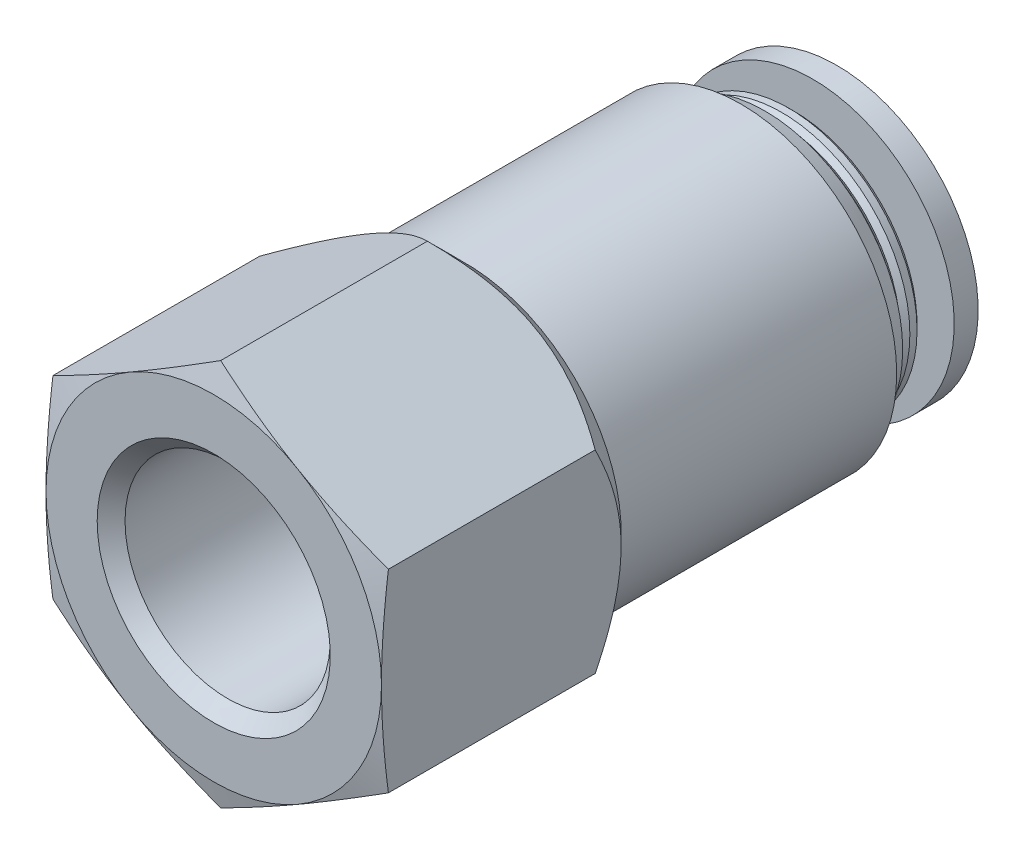
ISO-10303-21;
HEADER;
FILE_DESCRIPTION(('STEP AP214'),'2;1');
FILE_NAME('part.step','',(''),(''),'','','');
FILE_SCHEMA(('AUTOMOTIVE_DESIGN { 1 0 10303 214 1 1 1 1 }'));
ENDSEC;
DATA;
#1=APPLICATION_CONTEXT('core data for automotive mechanical design processes');
#2=APPLICATION_PROTOCOL_DEFINITION('international standard','automotive_design',2000,#1);
#3=PRODUCT_CONTEXT('',#1,'mechanical');
#4=PRODUCT('Part','Part','',(#3));
#5=PRODUCT_RELATED_PRODUCT_CATEGORY('part','',(#4));
#6=PRODUCT_DEFINITION_FORMATION('','',#4);
#7=PRODUCT_DEFINITION_CONTEXT('part definition',#1,'design');
#8=PRODUCT_DEFINITION('design','',#6,#7);
#9=PRODUCT_DEFINITION_SHAPE('','',#8);
#10=(LENGTH_UNIT() NAMED_UNIT(*) SI_UNIT(.MILLI.,.METRE.));
#11=(NAMED_UNIT(*) PLANE_ANGLE_UNIT() SI_UNIT($,.RADIAN.));
#12=(NAMED_UNIT(*) SI_UNIT($,.STERADIAN.) SOLID_ANGLE_UNIT());
#13=UNCERTAINTY_MEASURE_WITH_UNIT(LENGTH_MEASURE(1.E-05),#10,'distance_accuracy_value','');
#14=(GEOMETRIC_REPRESENTATION_CONTEXT(3) GLOBAL_UNCERTAINTY_ASSIGNED_CONTEXT((#13)) GLOBAL_UNIT_ASSIGNED_CONTEXT((#10,
#11,#12)) REPRESENTATION_CONTEXT('',''));
#15=CARTESIAN_POINT('',(0.,0.,0.));
#16=DIRECTION('',(0.,0.,1.));
#17=DIRECTION('',(1.,0.,0.));
#18=AXIS2_PLACEMENT_3D('',#15,#16,#17);
#19=CARTESIAN_POINT('',(0.,0.,19.5));
#20=DIRECTION('',(0.,0.,1.));
#21=DIRECTION('',(-1.,0.,0.));
#22=AXIS2_PLACEMENT_3D('',#19,#20,#21);
#23=CYLINDRICAL_SURFACE('',#22,4.283);
#24=CARTESIAN_POINT('',(0.,0.,19.5));
#25=DIRECTION('',(0.,0.,-1.));
#26=DIRECTION('',(-1.,0.,0.));
#27=AXIS2_PLACEMENT_3D('',#24,#25,#26);
#28=CIRCLE('',#27,4.283);
#29=CARTESIAN_POINT('',(-4.283,0.,19.5));
#30=VERTEX_POINT('',#29);
#31=EDGE_CURVE('E328',#30,#30,#28,.T.);
#32=ORIENTED_EDGE('',*,*,#31,.T.);
#33=EDGE_LOOP('',(#32));
#34=FACE_BOUND('',#33,.T.);
#35=CARTESIAN_POINT('',(0.,0.,25.919));
#36=DIRECTION('',(0.,0.,-1.));
#37=DIRECTION('',(-1.,0.,0.));
#38=AXIS2_PLACEMENT_3D('',#35,#36,#37);
#39=CIRCLE('',#38,4.283);
#40=CARTESIAN_POINT('',(-4.283,0.,25.919));
#41=VERTEX_POINT('',#40);
#42=EDGE_CURVE('E555',#41,#41,#39,.T.);
#43=ORIENTED_EDGE('',*,*,#42,.F.);
#44=EDGE_LOOP('',(#43));
#45=FACE_BOUND('',#44,.T.);
#46=ADVANCED_FACE('F15',(#34,#45),#23,.F.);
#47=CARTESIAN_POINT('',(0.,0.,4.5));
#48=DIRECTION('',(0.,0.,1.));
#49=DIRECTION('',(1.,0.,0.));
#50=AXIS2_PLACEMENT_3D('',#47,#48,#49);
#51=CONICAL_SURFACE('',#50,6.5,1.22173047639603);
#52=CARTESIAN_POINT('',(0.,0.,4.33804128297466));
#53=DIRECTION('',(0.,0.,-1.));
#54=DIRECTION('',(-1.,0.,0.));
#55=AXIS2_PLACEMENT_3D('',#52,#53,#54);
#56=CIRCLE('',#55,6.05502208208904);
#57=CARTESIAN_POINT('',(-6.05502208208904,0.,4.33804128297466));
#58=VERTEX_POINT('',#57);
#59=EDGE_CURVE('E9',#58,#58,#56,.T.);
#60=ORIENTED_EDGE('',*,*,#59,.F.);
#61=EDGE_LOOP('',(#60));
#62=FACE_BOUND('',#61,.T.);
#63=CARTESIAN_POINT('',(0.,0.,4.5));
#64=DIRECTION('',(0.,0.,-1.));
#65=DIRECTION('',(-1.,0.,0.));
#66=AXIS2_PLACEMENT_3D('',#63,#64,#65);
#67=CIRCLE('',#66,6.5);
#68=CARTESIAN_POINT('',(-6.5,0.,4.5));
#69=VERTEX_POINT('',#68);
#70=EDGE_CURVE('E144',#69,#69,#67,.T.);
#71=ORIENTED_EDGE('',*,*,#70,.T.);
#72=EDGE_LOOP('',(#71));
#73=FACE_BOUND('',#72,.T.);
#74=ADVANCED_FACE('F536',(#62,#73),#51,.T.);
#75=CARTESIAN_POINT('',(0.,0.,4.33804128297466));
#76=DIRECTION('',(0.,0.,1.));
#77=DIRECTION('',(1.,0.,0.));
#78=AXIS2_PLACEMENT_3D('',#75,#76,#77);
#79=CONICAL_SURFACE('',#78,6.05502208208904,0.349065850398866);
#80=CARTESIAN_POINT('',(0.,0.,3.5));
#81=DIRECTION('',(0.,0.,-1.));
#82=DIRECTION('',(-1.,0.,0.));
#83=AXIS2_PLACEMENT_3D('',#80,#81,#82);
#84=CIRCLE('',#83,5.75);
#85=CARTESIAN_POINT('',(-5.75,0.,3.5));
#86=VERTEX_POINT('',#85);
#87=EDGE_CURVE('E28',#86,#86,#84,.T.);
#88=ORIENTED_EDGE('',*,*,#87,.F.);
#89=EDGE_LOOP('',(#88));
#90=FACE_BOUND('',#89,.T.);
#91=ORIENTED_EDGE('',*,*,#59,.T.);
#92=EDGE_LOOP('',(#91));
#93=FACE_BOUND('',#92,.T.);
#94=ADVANCED_FACE('F17',(#90,#93),#79,.T.);
#95=CARTESIAN_POINT('',(0.,5.75,3.5));
#96=DIRECTION('',(0.,0.,1.));
#97=DIRECTION('',(1.,0.,0.));
#98=AXIS2_PLACEMENT_3D('',#95,#96,#97);
#99=PLANE('',#98);
#100=CARTESIAN_POINT('',(0.,0.,3.5));
#101=DIRECTION('',(0.,0.,-1.));
#102=DIRECTION('',(-1.,0.,0.));
#103=AXIS2_PLACEMENT_3D('',#100,#101,#102);
#104=CIRCLE('',#103,5.35);
#105=CARTESIAN_POINT('',(-5.35,0.,3.5));
#106=VERTEX_POINT('',#105);
#107=EDGE_CURVE('E685',#106,#106,#104,.T.);
#108=ORIENTED_EDGE('',*,*,#107,.F.);
#109=EDGE_LOOP('',(#108));
#110=FACE_BOUND('',#109,.T.);
#111=ORIENTED_EDGE('',*,*,#87,.T.);
#112=EDGE_LOOP('',(#111));
#113=FACE_BOUND('',#112,.T.);
#114=ADVANCED_FACE('F356',(#110,#113),#99,.F.);
#115=CARTESIAN_POINT('',(0.,0.,0.));
#116=DIRECTION('',(0.,0.,1.));
#117=DIRECTION('',(-1.,0.,0.));
#118=AXIS2_PLACEMENT_3D('',#115,#116,#117);
#119=CYLINDRICAL_SURFACE('',#118,5.35);
#120=CARTESIAN_POINT('',(0.,0.,3.2));
#121=DIRECTION('',(0.,0.,-1.));
#122=DIRECTION('',(-1.,0.,0.));
#123=AXIS2_PLACEMENT_3D('',#120,#121,#122);
#124=CIRCLE('',#123,5.35);
#125=CARTESIAN_POINT('',(-5.35,0.,3.2));
#126=VERTEX_POINT('',#125);
#127=EDGE_CURVE('E678',#126,#126,#124,.T.);
#128=ORIENTED_EDGE('',*,*,#127,.F.);
#129=EDGE_LOOP('',(#128));
#130=FACE_BOUND('',#129,.T.);
#131=ORIENTED_EDGE('',*,*,#107,.T.);
#132=EDGE_LOOP('',(#131));
#133=FACE_BOUND('',#132,.T.);
#134=ADVANCED_FACE('F995',(#130,#133),#119,.T.);
#135=CARTESIAN_POINT('',(0.,0.,3.2));
#136=DIRECTION('',(0.,0.,1.));
#137=DIRECTION('',(1.,0.,0.));
#138=AXIS2_PLACEMENT_3D('',#135,#136,#137);
#139=CONICAL_SURFACE('',#138,5.35,0.785398163397449);
#140=CARTESIAN_POINT('',(0.,0.,3.));
#141=DIRECTION('',(0.,0.,-1.));
#142=DIRECTION('',(-1.,0.,0.));
#143=AXIS2_PLACEMENT_3D('',#140,#141,#142);
#144=CIRCLE('',#143,5.15);
#145=CARTESIAN_POINT('',(-5.15,0.,3.));
#146=VERTEX_POINT('',#145);
#147=EDGE_CURVE('E175',#146,#146,#144,.T.);
#148=ORIENTED_EDGE('',*,*,#147,.F.);
#149=EDGE_LOOP('',(#148));
#150=FACE_BOUND('',#149,.T.);
#151=ORIENTED_EDGE('',*,*,#127,.T.);
#152=EDGE_LOOP('',(#151));
#153=FACE_BOUND('',#152,.T.);
#154=ADVANCED_FACE('F765',(#150,#153),#139,.T.);
#155=CARTESIAN_POINT('',(0.,0.,3.));
#156=DIRECTION('',(0.,0.,-1.));
#157=DIRECTION('',(-1.,0.,0.));
#158=AXIS2_PLACEMENT_3D('',#155,#156,#157);
#159=CONICAL_SURFACE('',#158,5.15,0.785398163397449);
#160=ORIENTED_EDGE('',*,*,#147,.T.);
#161=EDGE_LOOP('',(#160));
#162=FACE_BOUND('',#161,.T.);
#163=CARTESIAN_POINT('',(0.,0.,2.8));
#164=DIRECTION('',(0.,0.,-1.));
#165=DIRECTION('',(-1.,0.,0.));
#166=AXIS2_PLACEMENT_3D('',#163,#164,#165);
#167=CIRCLE('',#166,5.35);
#168=CARTESIAN_POINT('',(-5.35,0.,2.8));
#169=VERTEX_POINT('',#168);
#170=EDGE_CURVE('E169',#169,#169,#167,.T.);
#171=ORIENTED_EDGE('',*,*,#170,.F.);
#172=EDGE_LOOP('',(#171));
#173=FACE_BOUND('',#172,.T.);
#174=ADVANCED_FACE('F452',(#162,#173),#159,.T.);
#175=CARTESIAN_POINT('',(0.,0.,0.));
#176=DIRECTION('',(0.,0.,1.));
#177=DIRECTION('',(-1.,0.,0.));
#178=AXIS2_PLACEMENT_3D('',#175,#176,#177);
#179=CYLINDRICAL_SURFACE('',#178,5.35);
#180=CARTESIAN_POINT('',(0.,0.,2.5));
#181=DIRECTION('',(0.,0.,-1.));
#182=DIRECTION('',(-1.,0.,0.));
#183=AXIS2_PLACEMENT_3D('',#180,#181,#182);
#184=CIRCLE('',#183,5.35);
#185=CARTESIAN_POINT('',(-5.35,0.,2.5));
#186=VERTEX_POINT('',#185);
#187=EDGE_CURVE('E165',#186,#186,#184,.T.);
#188=ORIENTED_EDGE('',*,*,#187,.F.);
#189=EDGE_LOOP('',(#188));
#190=FACE_BOUND('',#189,.T.);
#191=ORIENTED_EDGE('',*,*,#170,.T.);
#192=EDGE_LOOP('',(#191));
#193=FACE_BOUND('',#192,.T.);
#194=ADVANCED_FACE('F253',(#190,#193),#179,.T.);
#195=CARTESIAN_POINT('',(0.,0.,2.5));
#196=DIRECTION('',(0.,0.,1.));
#197=DIRECTION('',(1.,0.,0.));
#198=AXIS2_PLACEMENT_3D('',#195,#196,#197);
#199=CONICAL_SURFACE('',#198,5.35,0.785398163397449);
#200=CARTESIAN_POINT('',(0.,0.,2.3));
#201=DIRECTION('',(0.,0.,-1.));
#202=DIRECTION('',(-1.,0.,0.));
#203=AXIS2_PLACEMENT_3D('',#200,#201,#202);
#204=CIRCLE('',#203,5.15);
#205=CARTESIAN_POINT('',(-5.15,0.,2.3));
#206=VERTEX_POINT('',#205);
#207=EDGE_CURVE('E160',#206,#206,#204,.T.);
#208=ORIENTED_EDGE('',*,*,#207,.F.);
#209=EDGE_LOOP('',(#208));
#210=FACE_BOUND('',#209,.T.);
#211=ORIENTED_EDGE('',*,*,#187,.T.);
#212=EDGE_LOOP('',(#211));
#213=FACE_BOUND('',#212,.T.);
#214=ADVANCED_FACE('F166',(#210,#213),#199,.T.);
#215=CARTESIAN_POINT('',(0.,5.15,2.3));
#216=DIRECTION('',(0.,0.,1.));
#217=DIRECTION('',(1.,0.,0.));
#218=AXIS2_PLACEMENT_3D('',#215,#216,#217);
#219=PLANE('',#218);
#220=CARTESIAN_POINT('',(0.,0.,2.3));
#221=DIRECTION('',(0.,0.,-1.));
#222=DIRECTION('',(-1.,0.,0.));
#223=AXIS2_PLACEMENT_3D('',#220,#221,#222);
#224=CIRCLE('',#223,4.);
#225=CARTESIAN_POINT('',(-4.,0.,2.3));
#226=VERTEX_POINT('',#225);
#227=EDGE_CURVE('E178',#226,#226,#224,.T.);
#228=ORIENTED_EDGE('',*,*,#227,.F.);
#229=EDGE_LOOP('',(#228));
#230=FACE_BOUND('',#229,.T.);
#231=ORIENTED_EDGE('',*,*,#207,.T.);
#232=EDGE_LOOP('',(#231));
#233=FACE_BOUND('',#232,.T.);
#234=ADVANCED_FACE('F493',(#230,#233),#219,.F.);
#235=CARTESIAN_POINT('',(0.,0.,0.));
#236=DIRECTION('',(0.,0.,1.));
#237=DIRECTION('',(-1.,0.,0.));
#238=AXIS2_PLACEMENT_3D('',#235,#236,#237);
#239=CYLINDRICAL_SURFACE('',#238,4.);
#240=CARTESIAN_POINT('',(0.,0.,1.5));
#241=DIRECTION('',(0.,0.,-1.));
#242=DIRECTION('',(-1.,0.,0.));
#243=AXIS2_PLACEMENT_3D('',#240,#241,#242);
#244=CIRCLE('',#243,4.);
#245=CARTESIAN_POINT('',(-4.,0.,1.5));
#246=VERTEX_POINT('',#245);
#247=EDGE_CURVE('E665',#246,#246,#244,.T.);
#248=ORIENTED_EDGE('',*,*,#247,.F.);
#249=EDGE_LOOP('',(#248));
#250=FACE_BOUND('',#249,.T.);
#251=ORIENTED_EDGE('',*,*,#227,.T.);
#252=EDGE_LOOP('',(#251));
#253=FACE_BOUND('',#252,.T.);
#254=ADVANCED_FACE('F495',(#250,#253),#239,.T.);
#255=CARTESIAN_POINT('',(0.,4.,1.5));
#256=DIRECTION('',(0.,0.,-1.));
#257=DIRECTION('',(0.,-1.,0.));
#258=AXIS2_PLACEMENT_3D('',#255,#256,#257);
#259=PLANE('',#258);
#260=ORIENTED_EDGE('',*,*,#247,.T.);
#261=EDGE_LOOP('',(#260));
#262=FACE_BOUND('',#261,.T.);
#263=CARTESIAN_POINT('',(0.,0.,1.5));
#264=DIRECTION('',(0.,0.,-1.));
#265=DIRECTION('',(-1.,0.,0.));
#266=AXIS2_PLACEMENT_3D('',#263,#264,#265);
#267=CIRCLE('',#266,5.9);
#268=CARTESIAN_POINT('',(-5.9,0.,1.5));
#269=VERTEX_POINT('',#268);
#270=EDGE_CURVE('E661',#269,#269,#267,.T.);
#271=ORIENTED_EDGE('',*,*,#270,.F.);
#272=EDGE_LOOP('',(#271));
#273=FACE_BOUND('',#272,.T.);
#274=ADVANCED_FACE('F497',(#262,#273),#259,.F.);
#275=CARTESIAN_POINT('',(0.,0.,0.));
#276=DIRECTION('',(0.,0.,1.));
#277=DIRECTION('',(-1.,0.,0.));
#278=AXIS2_PLACEMENT_3D('',#275,#276,#277);
#279=CYLINDRICAL_SURFACE('',#278,5.9);
#280=CARTESIAN_POINT('',(0.,0.,0.5));
#281=DIRECTION('',(0.,0.,-1.));
#282=DIRECTION('',(-1.,0.,0.));
#283=AXIS2_PLACEMENT_3D('',#280,#281,#282);
#284=CIRCLE('',#283,5.9);
#285=CARTESIAN_POINT('',(-5.9,0.,0.5));
#286=VERTEX_POINT('',#285);
#287=EDGE_CURVE('E659',#286,#286,#284,.T.);
#288=ORIENTED_EDGE('',*,*,#287,.F.);
#289=EDGE_LOOP('',(#288));
#290=FACE_BOUND('',#289,.T.);
#291=ORIENTED_EDGE('',*,*,#270,.T.);
#292=EDGE_LOOP('',(#291));
#293=FACE_BOUND('',#292,.T.);
#294=ADVANCED_FACE('F489',(#290,#293),#279,.T.);
#295=CARTESIAN_POINT('',(0.,0.,0.5));
#296=DIRECTION('',(0.,0.,1.));
#297=DIRECTION('',(1.,0.,0.));
#298=AXIS2_PLACEMENT_3D('',#295,#296,#297);
#299=CONICAL_SURFACE('',#298,5.9,1.31347261182381);
#300=CARTESIAN_POINT('',(0.,0.,0.));
#301=DIRECTION('',(0.,0.,-1.));
#302=DIRECTION('',(-1.,0.,0.));
#303=AXIS2_PLACEMENT_3D('',#300,#301,#302);
#304=CIRCLE('',#303,4.);
#305=CARTESIAN_POINT('',(-4.,0.,0.));
#306=VERTEX_POINT('',#305);
#307=EDGE_CURVE('E670',#306,#306,#304,.T.);
#308=ORIENTED_EDGE('',*,*,#307,.F.);
#309=EDGE_LOOP('',(#308));
#310=FACE_BOUND('',#309,.T.);
#311=ORIENTED_EDGE('',*,*,#287,.T.);
#312=EDGE_LOOP('',(#311));
#313=FACE_BOUND('',#312,.T.);
#314=ADVANCED_FACE('F484',(#310,#313),#299,.T.);
#315=CARTESIAN_POINT('',(0.,4.,0.));
#316=DIRECTION('',(0.,0.,1.));
#317=DIRECTION('',(1.,0.,0.));
#318=AXIS2_PLACEMENT_3D('',#315,#316,#317);
#319=PLANE('',#318);
#320=CARTESIAN_POINT('',(0.,0.,0.));
#321=DIRECTION('',(0.,0.,-1.));
#322=DIRECTION('',(-1.,0.,0.));
#323=AXIS2_PLACEMENT_3D('',#320,#321,#322);
#324=CIRCLE('',#323,3.);
#325=CARTESIAN_POINT('',(-3.,0.,0.));
#326=VERTEX_POINT('',#325);
#327=EDGE_CURVE('E674',#326,#326,#324,.T.);
#328=ORIENTED_EDGE('',*,*,#327,.F.);
#329=EDGE_LOOP('',(#328));
#330=FACE_BOUND('',#329,.T.);
#331=ORIENTED_EDGE('',*,*,#307,.T.);
#332=EDGE_LOOP('',(#331));
#333=FACE_BOUND('',#332,.T.);
#334=ADVANCED_FACE('F488',(#330,#333),#319,.F.);
#335=CARTESIAN_POINT('',(0.,0.,0.));
#336=DIRECTION('',(0.,0.,1.));
#337=DIRECTION('',(-1.,0.,0.));
#338=AXIS2_PLACEMENT_3D('',#335,#336,#337);
#339=CYLINDRICAL_SURFACE('',#338,3.);
#340=CARTESIAN_POINT('',(0.,0.,17.));
#341=DIRECTION('',(0.,0.,-1.));
#342=DIRECTION('',(-1.,0.,0.));
#343=AXIS2_PLACEMENT_3D('',#340,#341,#342);
#344=CIRCLE('',#343,3.);
#345=CARTESIAN_POINT('',(-3.,0.,17.));
#346=VERTEX_POINT('',#345);
#347=EDGE_CURVE('E270',#346,#346,#344,.T.);
#348=ORIENTED_EDGE('',*,*,#347,.F.);
#349=EDGE_LOOP('',(#348));
#350=FACE_BOUND('',#349,.T.);
#351=ORIENTED_EDGE('',*,*,#327,.T.);
#352=EDGE_LOOP('',(#351));
#353=FACE_BOUND('',#352,.T.);
#354=ADVANCED_FACE('F501',(#350,#353),#339,.F.);
#355=CARTESIAN_POINT('',(0.,0.,17.));
#356=DIRECTION('',(0.,0.,1.));
#357=DIRECTION('',(1.,0.,0.));
#358=AXIS2_PLACEMENT_3D('',#355,#356,#357);
#359=CONICAL_SURFACE('',#358,3.,0.349065850398866);
#360=ORIENTED_EDGE('',*,*,#347,.T.);
#361=EDGE_LOOP('',(#360));
#362=FACE_BOUND('',#361,.T.);
#363=CARTESIAN_POINT('',(0.,0.,19.5));
#364=DIRECTION('',(0.,0.,-1.));
#365=DIRECTION('',(-1.,0.,0.));
#366=AXIS2_PLACEMENT_3D('',#363,#364,#365);
#367=CIRCLE('',#366,3.90992558566551);
#368=CARTESIAN_POINT('',(-3.90992558566551,0.,19.5));
#369=VERTEX_POINT('',#368);
#370=EDGE_CURVE('E182',#369,#369,#367,.T.);
#371=ORIENTED_EDGE('',*,*,#370,.F.);
#372=EDGE_LOOP('',(#371));
#373=FACE_BOUND('',#372,.T.);
#374=ADVANCED_FACE('F454',(#362,#373),#359,.F.);
#375=CARTESIAN_POINT('',(-7.,4.04145188432738,16.));
#376=DIRECTION('',(-1.,0.,0.));
#377=DIRECTION('',(0.,0.,1.));
#378=AXIS2_PLACEMENT_3D('',#375,#376,#377);
#379=PLANE('',#378);
#380=CARTESIAN_POINT('',(-7.,-4.04145188432738,26.2098368097083));
#381=CARTESIAN_POINT('',(-7.,-2.97869081401696,26.3522197949768));
#382=CARTESIAN_POINT('',(-7.,-2.02017976804719,26.4234523991461));
#383=CARTESIAN_POINT('',(-7.,-0.990149744345751,26.5));
#384=CARTESIAN_POINT('',(-7.,0.,26.5));
#385=B_SPLINE_CURVE_WITH_KNOTS('',2,(#380,#381,#382,#383,#384),.UNSPECIFIED.,.F.,.F.,(3,2,3),
(0.,0.5,1.),.UNSPECIFIED.);
#386=CARTESIAN_POINT('',(-7.,-4.04145188432738,26.2098368097083));
#387=VERTEX_POINT('',#386);
#388=CARTESIAN_POINT('',(-7.,0.,26.5));
#389=VERTEX_POINT('',#388);
#390=EDGE_CURVE('E516',#387,#389,#385,.T.);
#391=ORIENTED_EDGE('',*,*,#390,.T.);
#392=CARTESIAN_POINT('',(-7.,0.,26.5));
#393=CARTESIAN_POINT('',(-7.,1.8756443470176,26.5));
#394=CARTESIAN_POINT('',(-7.,4.04145188432738,26.2098368097083));
#395=B_SPLINE_CURVE_WITH_KNOTS('',2,(#392,#393,#394),.UNSPECIFIED.,.F.,.F.,(3,3),(0.,1.),.UNSPECIFIED.);
#396=CARTESIAN_POINT('',(-7.,4.04145188432738,26.2098368097083));
#397=VERTEX_POINT('',#396);
#398=EDGE_CURVE('E299',#389,#397,#395,.T.);
#399=ORIENTED_EDGE('',*,*,#398,.T.);
#400=DIRECTION('',(0.,0.,1.));
#401=VECTOR('',#400,1.);
#402=CARTESIAN_POINT('',(-7.,4.04145188432738,16.));
#403=LINE('',#402,#401);
#404=CARTESIAN_POINT('',(-7.,4.04145188432738,17.5829037686548));
#405=VERTEX_POINT('',#404);
#406=EDGE_CURVE('E324',#405,#397,#403,.T.);
#407=ORIENTED_EDGE('',*,*,#406,.F.);
#408=CARTESIAN_POINT('',(-7.,4.04145188432738,17.5829037686548));
#409=CARTESIAN_POINT('',(-7.,3.01197757082129,17.0681666119017));
#410=CARTESIAN_POINT('',(-7.,2.081303600006,16.8028641419239));
#411=CARTESIAN_POINT('',(-7.,1.02005282265252,16.5003388093942));
#412=CARTESIAN_POINT('',(-7.,0.00177313035275902,16.5000002245708));
#413=CARTESIAN_POINT('',(-7.,-1.01656910779978,16.4996616189504));
#414=CARTESIAN_POINT('',(-7.,-2.07999426577288,16.8024910917884));
#415=CARTESIAN_POINT('',(-7.,-3.01069298940647,17.067524321194));
#416=CARTESIAN_POINT('',(-7.,-4.04145188432738,17.5829037686548));
#417=B_SPLINE_CURVE_WITH_KNOTS('',2,(#408,#409,#410,#411,#412,#413,#414,#415,#416),
.UNSPECIFIED.,.F.,.F.,(3,2,2,2,3),(0.,0.25,0.5,0.75,1.),.UNSPECIFIED.);
#418=CARTESIAN_POINT('',(-7.,-4.04145188432738,17.5829037686548));
#419=VERTEX_POINT('',#418);
#420=EDGE_CURVE('E550',#405,#419,#417,.T.);
#421=ORIENTED_EDGE('',*,*,#420,.T.);
#422=DIRECTION('',(0.,0.,1.));
#423=VECTOR('',#422,1.);
#424=CARTESIAN_POINT('',(-7.,-4.04145188432738,16.));
#425=LINE('',#424,#423);
#426=EDGE_CURVE('E380',#419,#387,#425,.T.);
#427=ORIENTED_EDGE('',*,*,#426,.T.);
#428=EDGE_LOOP('',(#391,#399,#407,#421,#427));
#429=FACE_BOUND('',#428,.T.);
#430=ADVANCED_FACE('F211',(#429),#379,.T.);
#431=CARTESIAN_POINT('',(7.,4.04145188432738,16.));
#432=DIRECTION('',(0.5,0.866025403784439,0.));
#433=DIRECTION('',(0.,0.,-1.));
#434=AXIS2_PLACEMENT_3D('',#431,#432,#433);
#435=PLANE('',#434);
#436=CARTESIAN_POINT('',(0.,8.08290376865476,26.2098368097085));
#437=CARTESIAN_POINT('',(1.87564434701639,7.00000000000084,26.5));
#438=CARTESIAN_POINT('',(3.5,6.06217782649107,26.5));
#439=B_SPLINE_CURVE_WITH_KNOTS('',2,(#436,#437,#438),.UNSPECIFIED.,.F.,.F.,(3,3),(0.,1.),.UNSPECIFIED.);
#440=CARTESIAN_POINT('',(0.,8.08290376865476,26.2098368097083));
#441=VERTEX_POINT('',#440);
#442=CARTESIAN_POINT('',(3.5,6.06217782649107,26.5));
#443=VERTEX_POINT('',#442);
#444=EDGE_CURVE('E195',#441,#443,#439,.T.);
#445=ORIENTED_EDGE('',*,*,#444,.T.);
#446=CARTESIAN_POINT('',(3.5,6.06217782649107,26.5));
#447=CARTESIAN_POINT('',(5.1243556529836,5.1243556529813,26.5));
#448=CARTESIAN_POINT('',(7.,4.04145188432738,26.2098368097085));
#449=B_SPLINE_CURVE_WITH_KNOTS('',2,(#446,#447,#448),.UNSPECIFIED.,.F.,.F.,(3,3),(0.,1.),.UNSPECIFIED.);
#450=CARTESIAN_POINT('',(7.,4.04145188432738,26.2098368097083));
#451=VERTEX_POINT('',#450);
#452=EDGE_CURVE('E232',#443,#451,#449,.T.);
#453=ORIENTED_EDGE('',*,*,#452,.T.);
#454=DIRECTION('',(0.,0.,1.));
#455=VECTOR('',#454,1.);
#456=CARTESIAN_POINT('',(7.,4.04145188432738,16.));
#457=LINE('',#456,#455);
#458=CARTESIAN_POINT('',(7.,4.04145188432738,17.5829037686548));
#459=VERTEX_POINT('',#458);
#460=EDGE_CURVE('E262',#459,#451,#457,.T.);
#461=ORIENTED_EDGE('',*,*,#460,.F.);
#462=CARTESIAN_POINT('',(7.,4.04145188432738,17.5829037686548));
#463=CARTESIAN_POINT('',(6.11501259574176,4.5523996004053,17.0719560525768));
#464=CARTESIAN_POINT('',(5.31453977573887,5.01455279851295,16.8068510862741));
#465=CARTESIAN_POINT('',(4.39484560613538,5.54553847490565,16.5022617413908));
#466=CARTESIAN_POINT('',(3.5128850710943,6.05473862722624,16.5000158118923));
#467=CARTESIAN_POINT('',(2.63021474124441,6.56434857977077,16.4977680748876));
#468=CARTESIAN_POINT('',(1.70887997841246,7.09628145310556,16.7991425004797));
#469=CARTESIAN_POINT('',(0.898226815189581,7.56431227511171,17.0643122751116));
#470=CARTESIAN_POINT('',(0.,8.08290376865478,17.5829037686547));
#471=B_SPLINE_CURVE_WITH_KNOTS('',2,(#462,#463,#464,#465,#466,#467,#468,#469,#470),
.UNSPECIFIED.,.F.,.F.,(3,2,2,2,3),(0.,0.25,0.5,0.75,1.),.UNSPECIFIED.);
#472=CARTESIAN_POINT('',(0.,8.08290376865476,17.5829037686548));
#473=VERTEX_POINT('',#472);
#474=EDGE_CURVE('E554',#459,#473,#471,.T.);
#475=ORIENTED_EDGE('',*,*,#474,.T.);
#476=DIRECTION('',(0.,0.,1.));
#477=VECTOR('',#476,1.);
#478=CARTESIAN_POINT('',(0.,8.08290376865476,16.));
#479=LINE('',#478,#477);
#480=EDGE_CURVE('E556',#473,#441,#479,.T.);
#481=ORIENTED_EDGE('',*,*,#480,.T.);
#482=EDGE_LOOP('',(#445,#453,#461,#475,#481));
#483=FACE_BOUND('',#482,.T.);
#484=ADVANCED_FACE('F201',(#483),#435,.T.);
#485=CARTESIAN_POINT('',(7.,-4.04145188432738,16.));
#486=DIRECTION('',(1.,0.,0.));
#487=DIRECTION('',(0.,1.,0.));
#488=AXIS2_PLACEMENT_3D('',#485,#486,#487);
#489=PLANE('',#488);
#490=CARTESIAN_POINT('',(7.,4.04145188432738,26.2098368097083));
#491=CARTESIAN_POINT('',(7.,1.87564434701761,26.5));
#492=CARTESIAN_POINT('',(7.,0.,26.5));
#493=B_SPLINE_CURVE_WITH_KNOTS('',2,(#490,#491,#492),.UNSPECIFIED.,.F.,.F.,(3,3),(0.,1.),.UNSPECIFIED.);
#494=CARTESIAN_POINT('',(7.,0.,26.5));
#495=VERTEX_POINT('',#494);
#496=EDGE_CURVE('E576',#451,#495,#493,.T.);
#497=ORIENTED_EDGE('',*,*,#496,.T.);
#498=CARTESIAN_POINT('',(7.,0.,26.5));
#499=CARTESIAN_POINT('',(7.,-0.989628842965374,26.5));
#500=CARTESIAN_POINT('',(7.,-2.02017976804718,26.4234523991461));
#501=CARTESIAN_POINT('',(7.,-2.97808767461878,26.3523006003341));
#502=CARTESIAN_POINT('',(7.,-4.04145188432738,26.2098368097083));
#503=B_SPLINE_CURVE_WITH_KNOTS('',2,(#498,#499,#500,#501,#502),.UNSPECIFIED.,.F.,.F.,(3,2,3),
(0.,0.5,1.),.UNSPECIFIED.);
#504=CARTESIAN_POINT('',(7.,-4.04145188432738,26.2098368097083));
#505=VERTEX_POINT('',#504);
#506=EDGE_CURVE('E277',#495,#505,#503,.T.);
#507=ORIENTED_EDGE('',*,*,#506,.T.);
#508=DIRECTION('',(0.,0.,1.));
#509=VECTOR('',#508,1.);
#510=CARTESIAN_POINT('',(7.,-4.04145188432738,16.));
#511=LINE('',#510,#509);
#512=CARTESIAN_POINT('',(7.,-4.04145188432738,17.5829037686548));
#513=VERTEX_POINT('',#512);
#514=EDGE_CURVE('E508',#513,#505,#511,.T.);
#515=ORIENTED_EDGE('',*,*,#514,.F.);
#516=CARTESIAN_POINT('',(7.,-4.04145188432738,17.5829037686548));
#517=CARTESIAN_POINT('',(7.,-3.01126093936133,17.0678082961715));
#518=CARTESIAN_POINT('',(7.,-2.07999426577287,16.8024910917884));
#519=CARTESIAN_POINT('',(7.,-1.01762569652326,16.4998230517825));
#520=CARTESIAN_POINT('',(7.,0.00177313035276076,16.5000002245708));
#521=CARTESIAN_POINT('',(7.,1.0189895798619,16.5001770180592));
#522=CARTESIAN_POINT('',(7.,2.081303600006,16.8028641419239));
#523=CARTESIAN_POINT('',(7.,3.01140197656456,17.0678788147733));
#524=CARTESIAN_POINT('',(7.,4.04145188432738,17.5829037686548));
#525=B_SPLINE_CURVE_WITH_KNOTS('',2,(#516,#517,#518,#519,#520,#521,#522,#523,#524),
.UNSPECIFIED.,.F.,.F.,(3,2,2,2,3),(0.,0.25,0.5,0.75,1.),.UNSPECIFIED.);
#526=EDGE_CURVE('E667',#513,#459,#525,.T.);
#527=ORIENTED_EDGE('',*,*,#526,.T.);
#528=ORIENTED_EDGE('',*,*,#460,.T.);
#529=EDGE_LOOP('',(#497,#507,#515,#527,#528));
#530=FACE_BOUND('',#529,.T.);
#531=ADVANCED_FACE('F210',(#530),#489,.T.);
#532=CARTESIAN_POINT('',(0.,0.,26.5));
#533=DIRECTION('',(0.,0.,-1.));
#534=DIRECTION('',(0.,-1.,0.));
#535=AXIS2_PLACEMENT_3D('',#532,#533,#534);
#536=PLANE('',#535);
#537=CARTESIAN_POINT('',(0.,0.,26.5));
#538=DIRECTION('',(0.,0.,-1.));
#539=DIRECTION('',(-1.,0.,0.));
#540=AXIS2_PLACEMENT_3D('',#537,#538,#539);
#541=CIRCLE('',#540,4.864);
#542=CARTESIAN_POINT('',(-4.864,0.,26.5));
#543=VERTEX_POINT('',#542);
#544=EDGE_CURVE('E701',#543,#543,#541,.T.);
#545=ORIENTED_EDGE('',*,*,#544,.T.);
#546=EDGE_LOOP('',(#545));
#547=FACE_BOUND('',#546,.T.);
#548=CARTESIAN_POINT('',(0.,0.,26.5));
#549=DIRECTION('',(0.,0.,-1.));
#550=DIRECTION('',(-1.,0.,0.));
#551=AXIS2_PLACEMENT_3D('',#548,#549,#550);
#552=CIRCLE('',#551,7.);
#553=CARTESIAN_POINT('',(-3.5,6.06217782649107,26.5));
#554=VERTEX_POINT('',#553);
#555=EDGE_CURVE('E271',#554,#443,#552,.T.);
#556=ORIENTED_EDGE('',*,*,#555,.F.);
#557=CARTESIAN_POINT('',(0.,0.,26.5));
#558=DIRECTION('',(0.,0.,-1.));
#559=DIRECTION('',(-1.,0.,0.));
#560=AXIS2_PLACEMENT_3D('',#557,#558,#559);
#561=CIRCLE('',#560,7.);
#562=EDGE_CURVE('E290',#389,#554,#561,.T.);
#563=ORIENTED_EDGE('',*,*,#562,.F.);
#564=CARTESIAN_POINT('',(0.,0.,26.5));
#565=DIRECTION('',(0.,0.,-1.));
#566=DIRECTION('',(-1.,0.,0.));
#567=AXIS2_PLACEMENT_3D('',#564,#565,#566);
#568=CIRCLE('',#567,7.);
#569=CARTESIAN_POINT('',(-3.5,-6.06217782649107,26.5));
#570=VERTEX_POINT('',#569);
#571=EDGE_CURVE('E316',#570,#389,#568,.T.);
#572=ORIENTED_EDGE('',*,*,#571,.F.);
#573=CARTESIAN_POINT('',(0.,0.,26.5));
#574=DIRECTION('',(0.,0.,-1.));
#575=DIRECTION('',(-1.,0.,0.));
#576=AXIS2_PLACEMENT_3D('',#573,#574,#575);
#577=CIRCLE('',#576,7.);
#578=CARTESIAN_POINT('',(3.5,-6.06217782649107,26.5));
#579=VERTEX_POINT('',#578);
#580=EDGE_CURVE('E184',#579,#570,#577,.T.);
#581=ORIENTED_EDGE('',*,*,#580,.F.);
#582=CARTESIAN_POINT('',(0.,0.,26.5));
#583=DIRECTION('',(0.,0.,-1.));
#584=DIRECTION('',(-1.,0.,0.));
#585=AXIS2_PLACEMENT_3D('',#582,#583,#584);
#586=CIRCLE('',#585,7.);
#587=EDGE_CURVE('E274',#495,#579,#586,.T.);
#588=ORIENTED_EDGE('',*,*,#587,.F.);
#589=CARTESIAN_POINT('',(0.,0.,26.5));
#590=DIRECTION('',(0.,0.,-1.));
#591=DIRECTION('',(-1.,0.,0.));
#592=AXIS2_PLACEMENT_3D('',#589,#590,#591);
#593=CIRCLE('',#592,7.);
#594=EDGE_CURVE('E288',#443,#495,#593,.T.);
#595=ORIENTED_EDGE('',*,*,#594,.F.);
#596=EDGE_LOOP('',(#556,#563,#572,#581,#588,#595));
#597=FACE_BOUND('',#596,.T.);
#598=ADVANCED_FACE('F483',(#547,#597),#536,.F.);
#599=CARTESIAN_POINT('',(0.,0.,26.5));
#600=DIRECTION('',(0.,0.,-1.));
#601=DIRECTION('',(-1.,0.,0.));
#602=AXIS2_PLACEMENT_3D('',#599,#600,#601);
#603=CONICAL_SURFACE('',#602,7.,1.30899693899575);
#604=ORIENTED_EDGE('',*,*,#444,.F.);
#605=CARTESIAN_POINT('',(-3.5,6.06217782649107,26.5));
#606=CARTESIAN_POINT('',(-1.87564434701639,7.00000000000084,26.5));
#607=CARTESIAN_POINT('',(0.,8.08290376865476,26.2098368097085));
#608=B_SPLINE_CURVE_WITH_KNOTS('',2,(#605,#606,#607),.UNSPECIFIED.,.F.,.F.,(3,3),(0.,1.),.UNSPECIFIED.);
#609=EDGE_CURVE('E435',#554,#441,#608,.T.);
#610=ORIENTED_EDGE('',*,*,#609,.F.);
#611=ORIENTED_EDGE('',*,*,#555,.T.);
#612=EDGE_LOOP('',(#604,#610,#611));
#613=FACE_BOUND('',#612,.T.);
#614=ADVANCED_FACE('F353',(#613),#603,.T.);
#615=CARTESIAN_POINT('',(-7.,-4.04145188432738,16.));
#616=DIRECTION('',(-0.5,-0.866025403784439,0.));
#617=DIRECTION('',(-0.866025403784439,0.5,0.));
#618=AXIS2_PLACEMENT_3D('',#615,#616,#617);
#619=PLANE('',#618);
#620=CARTESIAN_POINT('',(0.,-8.08290376865476,26.2098368097085));
#621=CARTESIAN_POINT('',(-1.87564434701639,-7.00000000000084,26.5));
#622=CARTESIAN_POINT('',(-3.5,-6.06217782649107,26.5));
#623=B_SPLINE_CURVE_WITH_KNOTS('',2,(#620,#621,#622),.UNSPECIFIED.,.F.,.F.,(3,3),(0.,1.),.UNSPECIFIED.);
#624=CARTESIAN_POINT('',(0.,-8.08290376865476,26.2098368097083));
#625=VERTEX_POINT('',#624);
#626=EDGE_CURVE('E307',#625,#570,#623,.T.);
#627=ORIENTED_EDGE('',*,*,#626,.T.);
#628=CARTESIAN_POINT('',(-3.5,-6.06217782649107,26.5));
#629=CARTESIAN_POINT('',(-5.1243556529836,-5.1243556529813,26.5));
#630=CARTESIAN_POINT('',(-7.,-4.04145188432738,26.2098368097085));
#631=B_SPLINE_CURVE_WITH_KNOTS('',2,(#628,#629,#630),.UNSPECIFIED.,.F.,.F.,(3,3),(0.,1.),.UNSPECIFIED.);
#632=EDGE_CURVE('E321',#570,#387,#631,.T.);
#633=ORIENTED_EDGE('',*,*,#632,.T.);
#634=ORIENTED_EDGE('',*,*,#426,.F.);
#635=CARTESIAN_POINT('',(-7.,-4.04145188432738,17.5829037686548));
#636=CARTESIAN_POINT('',(-6.11501259575491,-4.55239960039771,17.0719560525844));
#637=CARTESIAN_POINT('',(-5.31453977573887,-5.01455279851295,16.8068510862741));
#638=CARTESIAN_POINT('',(-4.39484560614671,-5.54553847489911,16.5022617413908));
#639=CARTESIAN_POINT('',(-3.5128850710943,-6.05473862722624,16.5000158118923));
#640=CARTESIAN_POINT('',(-2.63021474123601,-6.56434857977563,16.4977680748876));
#641=CARTESIAN_POINT('',(-1.70887997841246,-7.09628145310556,16.7991425004797));
#642=CARTESIAN_POINT('',(-0.898226815179837,-7.56431227511734,17.0643122751172));
#643=CARTESIAN_POINT('',(0.,-8.08290376865478,17.5829037686547));
#644=B_SPLINE_CURVE_WITH_KNOTS('',2,(#635,#636,#637,#638,#639,#640,#641,#642,#643),
.UNSPECIFIED.,.F.,.F.,(3,2,2,2,3),(0.,0.25,0.5,0.75,1.),.UNSPECIFIED.);
#645=CARTESIAN_POINT('',(0.,-8.08290376865476,17.5829037686548));
#646=VERTEX_POINT('',#645);
#647=EDGE_CURVE('E188',#419,#646,#644,.T.);
#648=ORIENTED_EDGE('',*,*,#647,.T.);
#649=DIRECTION('',(0.,0.,1.));
#650=VECTOR('',#649,1.);
#651=CARTESIAN_POINT('',(0.,-8.08290376865476,16.));
#652=LINE('',#651,#650);
#653=EDGE_CURVE('E639',#646,#625,#652,.T.);
#654=ORIENTED_EDGE('',*,*,#653,.T.);
#655=EDGE_LOOP('',(#627,#633,#634,#648,#654));
#656=FACE_BOUND('',#655,.T.);
#657=ADVANCED_FACE('F249',(#656),#619,.T.);
#658=CARTESIAN_POINT('',(0.,0.,26.5));
#659=DIRECTION('',(0.,0.,-1.));
#660=DIRECTION('',(-1.,0.,0.));
#661=AXIS2_PLACEMENT_3D('',#658,#659,#660);
#662=CONICAL_SURFACE('',#661,7.,1.30899693899575);
#663=ORIENTED_EDGE('',*,*,#452,.F.);
#664=ORIENTED_EDGE('',*,*,#594,.T.);
#665=ORIENTED_EDGE('',*,*,#496,.F.);
#666=EDGE_LOOP('',(#663,#664,#665));
#667=FACE_BOUND('',#666,.T.);
#668=ADVANCED_FACE('F238',(#667),#662,.T.);
#669=CARTESIAN_POINT('',(0.,0.,26.5));
#670=DIRECTION('',(0.,0.,-1.));
#671=DIRECTION('',(-1.,0.,0.));
#672=AXIS2_PLACEMENT_3D('',#669,#670,#671);
#673=CONICAL_SURFACE('',#672,7.,1.30899693899575);
#674=ORIENTED_EDGE('',*,*,#506,.F.);
#675=ORIENTED_EDGE('',*,*,#587,.T.);
#676=CARTESIAN_POINT('',(7.,-4.04145188432738,26.2098368097085));
#677=CARTESIAN_POINT('',(5.12435565298361,-5.12435565298129,26.5));
#678=CARTESIAN_POINT('',(3.5,-6.06217782649107,26.5));
#679=B_SPLINE_CURVE_WITH_KNOTS('',2,(#676,#677,#678),.UNSPECIFIED.,.F.,.F.,(3,3),(0.,1.),.UNSPECIFIED.);
#680=EDGE_CURVE('E592',#505,#579,#679,.T.);
#681=ORIENTED_EDGE('',*,*,#680,.F.);
#682=EDGE_LOOP('',(#674,#675,#681));
#683=FACE_BOUND('',#682,.T.);
#684=ADVANCED_FACE('F248',(#683),#673,.T.);
#685=CARTESIAN_POINT('',(0.,0.,26.5));
#686=DIRECTION('',(0.,0.,-1.));
#687=DIRECTION('',(-1.,0.,0.));
#688=AXIS2_PLACEMENT_3D('',#685,#686,#687);
#689=CONICAL_SURFACE('',#688,7.,1.30899693899575);
#690=ORIENTED_EDGE('',*,*,#398,.F.);
#691=ORIENTED_EDGE('',*,*,#562,.T.);
#692=CARTESIAN_POINT('',(-7.,4.04145188432738,26.2098368097085));
#693=CARTESIAN_POINT('',(-5.12435565298361,5.12435565298129,26.5));
#694=CARTESIAN_POINT('',(-3.5,6.06217782649107,26.5));
#695=B_SPLINE_CURVE_WITH_KNOTS('',2,(#692,#693,#694),.UNSPECIFIED.,.F.,.F.,(3,3),(0.,1.),.UNSPECIFIED.);
#696=EDGE_CURVE('E320',#397,#554,#695,.T.);
#697=ORIENTED_EDGE('',*,*,#696,.F.);
#698=EDGE_LOOP('',(#690,#691,#697));
#699=FACE_BOUND('',#698,.T.);
#700=ADVANCED_FACE('F474',(#699),#689,.T.);
#701=CARTESIAN_POINT('',(0.,0.,26.5));
#702=DIRECTION('',(0.,0.,-1.));
#703=DIRECTION('',(-1.,0.,0.));
#704=AXIS2_PLACEMENT_3D('',#701,#702,#703);
#705=CONICAL_SURFACE('',#704,7.,1.30899693899575);
#706=CARTESIAN_POINT('',(3.5,-6.06217782649107,26.5));
#707=CARTESIAN_POINT('',(1.87564434701639,-7.00000000000084,26.5));
#708=CARTESIAN_POINT('',(0.,-8.08290376865476,26.2098368097085));
#709=B_SPLINE_CURVE_WITH_KNOTS('',2,(#706,#707,#708),.UNSPECIFIED.,.F.,.F.,(3,3),(0.,1.),.UNSPECIFIED.);
#710=EDGE_CURVE('E596',#579,#625,#709,.T.);
#711=ORIENTED_EDGE('',*,*,#710,.F.);
#712=ORIENTED_EDGE('',*,*,#580,.T.);
#713=ORIENTED_EDGE('',*,*,#626,.F.);
#714=EDGE_LOOP('',(#711,#712,#713));
#715=FACE_BOUND('',#714,.T.);
#716=ADVANCED_FACE('F250',(#715),#705,.T.);
#717=CARTESIAN_POINT('',(0.,0.,0.));
#718=DIRECTION('',(0.,0.,1.));
#719=DIRECTION('',(-1.,0.,0.));
#720=AXIS2_PLACEMENT_3D('',#717,#718,#719);
#721=CYLINDRICAL_SURFACE('',#720,6.5);
#722=ORIENTED_EDGE('',*,*,#70,.F.);
#723=EDGE_LOOP('',(#722));
#724=FACE_BOUND('',#723,.T.);
#725=CARTESIAN_POINT('',(0.,0.,16.));
#726=DIRECTION('',(0.,0.,-1.));
#727=DIRECTION('',(-1.,0.,0.));
#728=AXIS2_PLACEMENT_3D('',#725,#726,#727);
#729=CIRCLE('',#728,6.5);
#730=CARTESIAN_POINT('',(-6.5,0.,16.));
#731=VERTEX_POINT('',#730);
#732=EDGE_CURVE('E135',#731,#731,#729,.T.);
#733=ORIENTED_EDGE('',*,*,#732,.T.);
#734=EDGE_LOOP('',(#733));
#735=FACE_BOUND('',#734,.T.);
#736=ADVANCED_FACE('F392',(#724,#735),#721,.T.);
#737=CARTESIAN_POINT('',(0.,0.,17.9));
#738=DIRECTION('',(0.,0.,1.));
#739=DIRECTION('',(1.,0.,0.));
#740=AXIS2_PLACEMENT_3D('',#737,#738,#739);
#741=CONICAL_SURFACE('',#740,8.4,0.785398163397448);
#742=ORIENTED_EDGE('',*,*,#732,.F.);
#743=EDGE_LOOP('',(#742));
#744=FACE_BOUND('',#743,.T.);
#745=ORIENTED_EDGE('',*,*,#420,.F.);
#746=CARTESIAN_POINT('',(0.,8.08290376865476,17.5829037686548));
#747=CARTESIAN_POINT('',(-0.884987404244621,7.5719560525847,17.0719560525847));
#748=CARTESIAN_POINT('',(-1.68546022426113,7.10980285446919,16.8068510862741));
#749=CARTESIAN_POINT('',(-2.6051543938529,6.57881717808325,16.5022617413908));
#750=CARTESIAN_POINT('',(-3.4871149289057,6.06961702575589,16.5000158118923));
#751=CARTESIAN_POINT('',(-4.36978525877543,5.56000707319991,16.4977680748876));
#752=CARTESIAN_POINT('',(-5.29112002158754,5.02807419987657,16.7991425004797));
#753=CARTESIAN_POINT('',(-6.10177318483348,4.56004337785711,17.0643122751249));
#754=CARTESIAN_POINT('',(-7.00000000000004,4.04145188432736,17.5829037686547));
#755=B_SPLINE_CURVE_WITH_KNOTS('',2,(#746,#747,#748,#749,#750,#751,#752,#753,#754),
.UNSPECIFIED.,.F.,.F.,(3,2,2,2,3),(0.,0.25,0.5,0.75,1.),.UNSPECIFIED.);
#756=EDGE_CURVE('E329',#473,#405,#755,.T.);
#757=ORIENTED_EDGE('',*,*,#756,.F.);
#758=ORIENTED_EDGE('',*,*,#474,.F.);
#759=ORIENTED_EDGE('',*,*,#526,.F.);
#760=CARTESIAN_POINT('',(0.,-8.08290376865476,17.5829037686548));
#761=CARTESIAN_POINT('',(0.884987404244621,-7.5719560525847,17.0719560525847));
#762=CARTESIAN_POINT('',(1.68546022426113,-7.10980285446919,16.8068510862741));
#763=CARTESIAN_POINT('',(2.6051543938529,-6.57881717808325,16.5022617413908));
#764=CARTESIAN_POINT('',(3.4871149289057,-6.06961702575589,16.5000158118923));
#765=CARTESIAN_POINT('',(4.36978525877543,-5.56000707319991,16.4977680748876));
#766=CARTESIAN_POINT('',(5.29112002158754,-5.02807419987657,16.7991425004797));
#767=CARTESIAN_POINT('',(6.10177318483348,-4.56004337785711,17.0643122751249));
#768=CARTESIAN_POINT('',(7.00000000000004,-4.04145188432736,17.5829037686547));
#769=B_SPLINE_CURVE_WITH_KNOTS('',2,(#760,#761,#762,#763,#764,#765,#766,#767,#768),
.UNSPECIFIED.,.F.,.F.,(3,2,2,2,3),(0.,0.25,0.5,0.75,1.),.UNSPECIFIED.);
#770=EDGE_CURVE('E517',#646,#513,#769,.T.);
#771=ORIENTED_EDGE('',*,*,#770,.F.);
#772=ORIENTED_EDGE('',*,*,#647,.F.);
#773=EDGE_LOOP('',(#745,#757,#758,#759,#771,#772));
#774=FACE_BOUND('',#773,.T.);
#775=ADVANCED_FACE('F382',(#744,#774),#741,.T.);
#776=CARTESIAN_POINT('',(0.,0.,26.5));
#777=DIRECTION('',(0.,0.,1.));
#778=DIRECTION('',(1.,0.,0.));
#779=AXIS2_PLACEMENT_3D('',#776,#777,#778);
#780=CONICAL_SURFACE('',#779,4.864,0.78539816339745);
#781=ORIENTED_EDGE('',*,*,#42,.T.);
#782=EDGE_LOOP('',(#781));
#783=FACE_BOUND('',#782,.T.);
#784=ORIENTED_EDGE('',*,*,#544,.F.);
#785=EDGE_LOOP('',(#784));
#786=FACE_BOUND('',#785,.T.);
#787=ADVANCED_FACE('F391',(#783,#786),#780,.F.);
#788=CARTESIAN_POINT('',(0.,4.283,19.5));
#789=DIRECTION('',(0.,0.,1.));
#790=DIRECTION('',(1.,0.,0.));
#791=AXIS2_PLACEMENT_3D('',#788,#789,#790);
#792=PLANE('',#791);
#793=ORIENTED_EDGE('',*,*,#370,.T.);
#794=EDGE_LOOP('',(#793));
#795=FACE_BOUND('',#794,.T.);
#796=ORIENTED_EDGE('',*,*,#31,.F.);
#797=EDGE_LOOP('',(#796));
#798=FACE_BOUND('',#797,.T.);
#799=ADVANCED_FACE('F451',(#795,#798),#792,.T.);
#800=CARTESIAN_POINT('',(0.,8.08290376865476,16.));
#801=DIRECTION('',(-0.5,0.866025403784439,0.));
#802=DIRECTION('',(0.,0.,1.));
#803=AXIS2_PLACEMENT_3D('',#800,#801,#802);
#804=PLANE('',#803);
#805=ORIENTED_EDGE('',*,*,#696,.T.);
#806=ORIENTED_EDGE('',*,*,#609,.T.);
#807=ORIENTED_EDGE('',*,*,#480,.F.);
#808=ORIENTED_EDGE('',*,*,#756,.T.);
#809=ORIENTED_EDGE('',*,*,#406,.T.);
#810=EDGE_LOOP('',(#805,#806,#807,#808,#809));
#811=FACE_BOUND('',#810,.T.);
#812=ADVANCED_FACE('F441',(#811),#804,.T.);
#813=CARTESIAN_POINT('',(0.,0.,26.5));
#814=DIRECTION('',(0.,0.,-1.));
#815=DIRECTION('',(-1.,0.,0.));
#816=AXIS2_PLACEMENT_3D('',#813,#814,#815);
#817=CONICAL_SURFACE('',#816,7.,1.30899693899575);
#818=ORIENTED_EDGE('',*,*,#390,.F.);
#819=ORIENTED_EDGE('',*,*,#632,.F.);
#820=ORIENTED_EDGE('',*,*,#571,.T.);
#821=EDGE_LOOP('',(#818,#819,#820));
#822=FACE_BOUND('',#821,.T.);
#823=ADVANCED_FACE('F394',(#822),#817,.T.);
#824=CARTESIAN_POINT('',(0.,-8.08290376865476,16.));
#825=DIRECTION('',(0.5,-0.866025403784439,0.));
#826=DIRECTION('',(0.,0.,-1.));
#827=AXIS2_PLACEMENT_3D('',#824,#825,#826);
#828=PLANE('',#827);
#829=ORIENTED_EDGE('',*,*,#680,.T.);
#830=ORIENTED_EDGE('',*,*,#710,.T.);
#831=ORIENTED_EDGE('',*,*,#653,.F.);
#832=ORIENTED_EDGE('',*,*,#770,.T.);
#833=ORIENTED_EDGE('',*,*,#514,.T.);
#834=EDGE_LOOP('',(#829,#830,#831,#832,#833));
#835=FACE_BOUND('',#834,.T.);
#836=ADVANCED_FACE('F601',(#835),#828,.T.);
#837=CLOSED_SHELL('',(#46,#74,#94,#114,#134,#154,#174,#194,#214,#234,#254,#274,#294,#314,#334,
#354,#374,#430,#484,#531,#598,#614,#657,#668,#684,#700,#716,#736,#775,#787,#799,#812,#823,#836));
#838=MANIFOLD_SOLID_BREP('B1',#837);
#839=ADVANCED_BREP_SHAPE_REPRESENTATION('',(#18,#838),#14);
#840=SHAPE_DEFINITION_REPRESENTATION(#9,#839);
ENDSEC;
END-ISO-10303-21;
